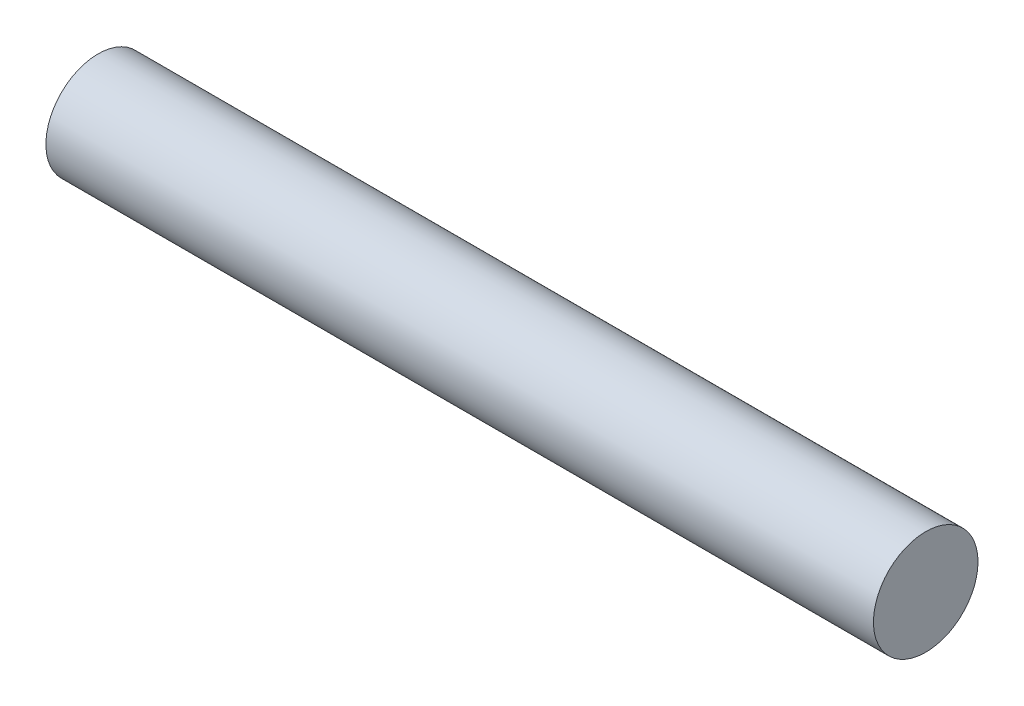
ISO-10303-21;
HEADER;
FILE_DESCRIPTION(('STEP AP214'),'2;1');
FILE_NAME('part.step','',(''),(''),'','','');
FILE_SCHEMA(('AUTOMOTIVE_DESIGN { 1 0 10303 214 1 1 1 1 }'));
ENDSEC;
DATA;
#1=APPLICATION_CONTEXT('core data for automotive mechanical design processes');
#2=APPLICATION_PROTOCOL_DEFINITION('international standard','automotive_design',2000,#1);
#3=PRODUCT_CONTEXT('',#1,'mechanical');
#4=PRODUCT('Part','Part','',(#3));
#5=PRODUCT_RELATED_PRODUCT_CATEGORY('part','',(#4));
#6=PRODUCT_DEFINITION_FORMATION('','',#4);
#7=PRODUCT_DEFINITION_CONTEXT('part definition',#1,'design');
#8=PRODUCT_DEFINITION('design','',#6,#7);
#9=PRODUCT_DEFINITION_SHAPE('','',#8);
#10=(LENGTH_UNIT() NAMED_UNIT(*) SI_UNIT(.MILLI.,.METRE.));
#11=(NAMED_UNIT(*) PLANE_ANGLE_UNIT() SI_UNIT($,.RADIAN.));
#12=(NAMED_UNIT(*) SI_UNIT($,.STERADIAN.) SOLID_ANGLE_UNIT());
#13=UNCERTAINTY_MEASURE_WITH_UNIT(LENGTH_MEASURE(1.E-05),#10,'distance_accuracy_value','');
#14=(GEOMETRIC_REPRESENTATION_CONTEXT(3) GLOBAL_UNCERTAINTY_ASSIGNED_CONTEXT((#13)) GLOBAL_UNIT_ASSIGNED_CONTEXT((#10,
#11,#12)) REPRESENTATION_CONTEXT('',''));
#15=CARTESIAN_POINT('',(0.,0.,0.));
#16=DIRECTION('',(0.,0.,1.));
#17=DIRECTION('',(1.,0.,0.));
#18=AXIS2_PLACEMENT_3D('',#15,#16,#17);
#19=CARTESIAN_POINT('',(19.,0.,0.));
#20=DIRECTION('',(-1.,0.,0.));
#21=DIRECTION('',(0.,0.,1.));
#22=AXIS2_PLACEMENT_3D('',#19,#20,#21);
#23=CYLINDRICAL_SURFACE('',#22,1.2);
#24=CARTESIAN_POINT('',(19.,0.,0.));
#25=DIRECTION('',(1.,0.,0.));
#26=DIRECTION('',(0.,0.,-1.));
#27=AXIS2_PLACEMENT_3D('',#24,#25,#26);
#28=CIRCLE('',#27,1.2);
#29=CARTESIAN_POINT('',(19.,0.,-1.2));
#30=VERTEX_POINT('',#29);
#31=EDGE_CURVE('E10',#30,#30,#28,.T.);
#32=ORIENTED_EDGE('',*,*,#31,.F.);
#33=EDGE_LOOP('',(#32));
#34=FACE_BOUND('',#33,.T.);
#35=CARTESIAN_POINT('',(0.,0.,0.));
#36=DIRECTION('',(1.,0.,0.));
#37=DIRECTION('',(0.,0.,-1.));
#38=AXIS2_PLACEMENT_3D('',#35,#36,#37);
#39=CIRCLE('',#38,1.2);
#40=CARTESIAN_POINT('',(0.,0.,-1.2));
#41=VERTEX_POINT('',#40);
#42=EDGE_CURVE('E33',#41,#41,#39,.T.);
#43=ORIENTED_EDGE('',*,*,#42,.T.);
#44=EDGE_LOOP('',(#43));
#45=FACE_BOUND('',#44,.T.);
#46=ADVANCED_FACE('F30',(#34,#45),#23,.T.);
#47=CARTESIAN_POINT('',(19.,0.,0.));
#48=DIRECTION('',(1.,0.,0.));
#49=DIRECTION('',(0.,0.,-1.));
#50=AXIS2_PLACEMENT_3D('',#47,#48,#49);
#51=PLANE('',#50);
#52=ORIENTED_EDGE('',*,*,#31,.T.);
#53=EDGE_LOOP('',(#52));
#54=FACE_BOUND('',#53,.T.);
#55=ADVANCED_FACE('F45',(#54),#51,.T.);
#56=CARTESIAN_POINT('',(0.,0.,0.));
#57=DIRECTION('',(1.,0.,0.));
#58=DIRECTION('',(0.,0.,-1.));
#59=AXIS2_PLACEMENT_3D('',#56,#57,#58);
#60=PLANE('',#59);
#61=ORIENTED_EDGE('',*,*,#42,.F.);
#62=EDGE_LOOP('',(#61));
#63=FACE_BOUND('',#62,.T.);
#64=ADVANCED_FACE('F43',(#63),#60,.F.);
#65=CLOSED_SHELL('',(#46,#55,#64));
#66=MANIFOLD_SOLID_BREP('B2',#65);
#67=ADVANCED_BREP_SHAPE_REPRESENTATION('',(#18,#66),#14);
#68=SHAPE_DEFINITION_REPRESENTATION(#9,#67);
ENDSEC;
END-ISO-10303-21;
